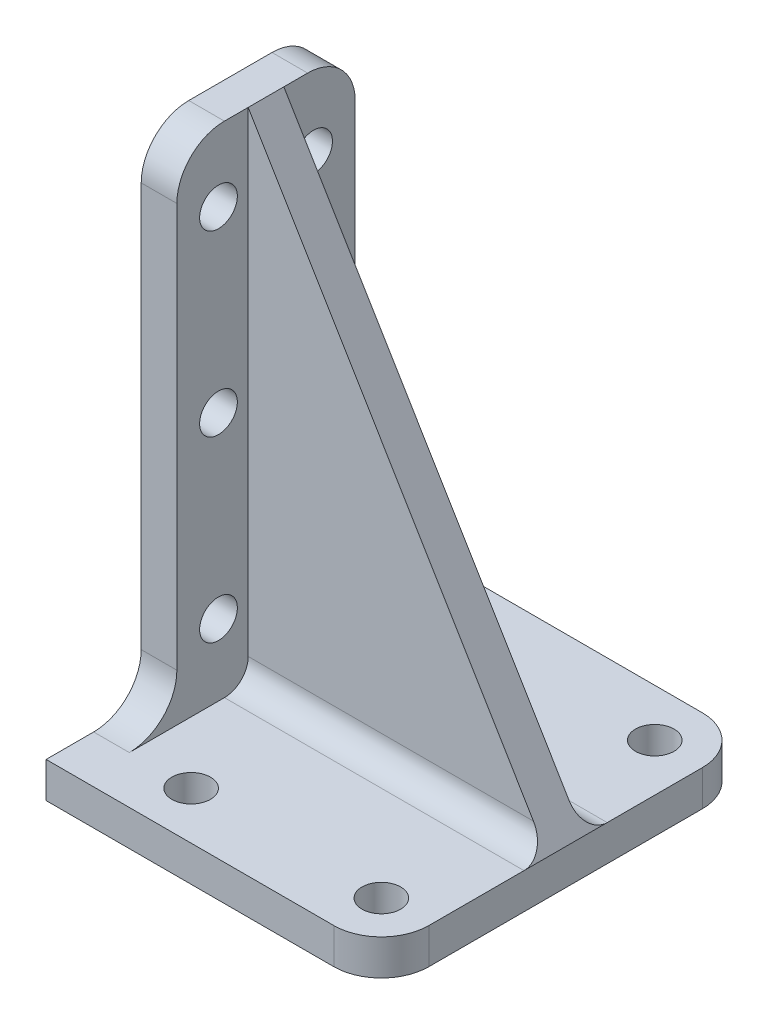
ISO-10303-21;
HEADER;
FILE_DESCRIPTION(('STEP AP214'),'2;1');
FILE_NAME('part.step','',(''),(''),'','','');
FILE_SCHEMA(('AUTOMOTIVE_DESIGN { 1 0 10303 214 1 1 1 1 }'));
ENDSEC;
DATA;
#1=APPLICATION_CONTEXT('core data for automotive mechanical design processes');
#2=APPLICATION_PROTOCOL_DEFINITION('international standard','automotive_design',2000,#1);
#3=PRODUCT_CONTEXT('',#1,'mechanical');
#4=PRODUCT('Part','Part','',(#3));
#5=PRODUCT_RELATED_PRODUCT_CATEGORY('part','',(#4));
#6=PRODUCT_DEFINITION_FORMATION('','',#4);
#7=PRODUCT_DEFINITION_CONTEXT('part definition',#1,'design');
#8=PRODUCT_DEFINITION('design','',#6,#7);
#9=PRODUCT_DEFINITION_SHAPE('','',#8);
#10=(LENGTH_UNIT() NAMED_UNIT(*) SI_UNIT(.MILLI.,.METRE.));
#11=(NAMED_UNIT(*) PLANE_ANGLE_UNIT() SI_UNIT($,.RADIAN.));
#12=(NAMED_UNIT(*) SI_UNIT($,.STERADIAN.) SOLID_ANGLE_UNIT());
#13=UNCERTAINTY_MEASURE_WITH_UNIT(LENGTH_MEASURE(1.E-05),#10,'distance_accuracy_value','');
#14=(GEOMETRIC_REPRESENTATION_CONTEXT(3) GLOBAL_UNCERTAINTY_ASSIGNED_CONTEXT((#13)) GLOBAL_UNIT_ASSIGNED_CONTEXT((#10,
#11,#12)) REPRESENTATION_CONTEXT('',''));
#15=CARTESIAN_POINT('',(0.,0.,0.));
#16=DIRECTION('',(0.,0.,1.));
#17=DIRECTION('',(1.,0.,0.));
#18=AXIS2_PLACEMENT_3D('',#15,#16,#17);
#19=CARTESIAN_POINT('',(0.,0.,30.));
#20=DIRECTION('',(0.,0.,-1.));
#21=DIRECTION('',(-1.,0.,0.));
#22=AXIS2_PLACEMENT_3D('',#19,#20,#21);
#23=PLANE('',#22);
#24=DIRECTION('',(0.,1.,0.));
#25=VECTOR('',#24,1.);
#26=CARTESIAN_POINT('',(6.,100.,30.));
#27=LINE('',#26,#25);
#28=CARTESIAN_POINT('',(6.,14.,30.));
#29=VERTEX_POINT('',#28);
#30=CARTESIAN_POINT('',(6.,82.,30.));
#31=VERTEX_POINT('',#30);
#32=EDGE_CURVE('E243',#29,#31,#27,.T.);
#33=ORIENTED_EDGE('',*,*,#32,.T.);
#34=DIRECTION('',(1.,0.,0.));
#35=VECTOR('',#34,1.);
#36=CARTESIAN_POINT('',(0.,82.,30.));
#37=LINE('',#36,#35);
#38=CARTESIAN_POINT('',(0.,82.,30.));
#39=VERTEX_POINT('',#38);
#40=EDGE_CURVE('E345',#31,#39,#37,.F.);
#41=ORIENTED_EDGE('',*,*,#40,.T.);
#42=DIRECTION('',(0.,-1.,0.));
#43=VECTOR('',#42,1.);
#44=CARTESIAN_POINT('',(0.,0.,30.));
#45=LINE('',#44,#43);
#46=CARTESIAN_POINT('',(0.,14.,30.));
#47=VERTEX_POINT('',#46);
#48=EDGE_CURVE('E192',#39,#47,#45,.T.);
#49=ORIENTED_EDGE('',*,*,#48,.T.);
#50=DIRECTION('',(-1.,0.,0.));
#51=VECTOR('',#50,1.);
#52=CARTESIAN_POINT('',(6.,14.,30.));
#53=LINE('',#52,#51);
#54=EDGE_CURVE('E284',#47,#29,#53,.F.);
#55=ORIENTED_EDGE('',*,*,#54,.T.);
#56=EDGE_LOOP('',(#33,#41,#49,#55));
#57=FACE_BOUND('',#56,.T.);
#58=ADVANCED_FACE('F42',(#57),#23,.F.);
#59=CARTESIAN_POINT('',(0.,100.,30.));
#60=DIRECTION('',(-0.857492925712544,-0.514495755427526,0.));
#61=DIRECTION('',(0.514495755427526,-0.857492925712544,0.));
#62=AXIS2_PLACEMENT_3D('',#59,#60,#61);
#63=PLANE('',#62);
#64=DIRECTION('',(0.514495755427526,-0.857492925712544,0.));
#65=VECTOR('',#64,1.);
#66=CARTESIAN_POINT('',(0.,100.,18.));
#67=LINE('',#66,#65);
#68=CARTESIAN_POINT('',(6.,90.,18.));
#69=VERTEX_POINT('',#68);
#70=CARTESIAN_POINT('',(54.,9.99999999999998,18.));
#71=VERTEX_POINT('',#70);
#72=EDGE_CURVE('E276',#69,#71,#67,.T.);
#73=ORIENTED_EDGE('',*,*,#72,.T.);
#74=CARTESIAN_POINT('',(54.,10.,22.));
#75=DIRECTION('',(-0.857492925712544,-0.514495755427526,0.));
#76=DIRECTION('',(0.514495755427526,-0.857492925712544,0.));
#77=AXIS2_PLACEMENT_3D('',#74,#75,#76);
#78=ELLIPSE('',#77,4.66476151587624,4.);
#79=CARTESIAN_POINT('',(56.4,6.,22.));
#80=VERTEX_POINT('',#79);
#81=EDGE_CURVE('E52',#71,#80,#78,.T.);
#82=ORIENTED_EDGE('',*,*,#81,.T.);
#83=DIRECTION('',(0.,0.,1.));
#84=VECTOR('',#83,1.);
#85=CARTESIAN_POINT('',(56.4,6.,0.));
#86=LINE('',#85,#84);
#87=CARTESIAN_POINT('',(56.4,6.,8.));
#88=VERTEX_POINT('',#87);
#89=EDGE_CURVE('E58',#88,#80,#86,.T.);
#90=ORIENTED_EDGE('',*,*,#89,.F.);
#91=CARTESIAN_POINT('',(54.,9.99999999999999,8.));
#92=DIRECTION('',(-0.857492925712544,-0.514495755427526,0.));
#93=DIRECTION('',(0.514495755427526,-0.857492925712544,0.));
#94=AXIS2_PLACEMENT_3D('',#91,#92,#93);
#95=ELLIPSE('',#94,4.66476151587624,4.);
#96=CARTESIAN_POINT('',(54.,9.99999999999998,12.));
#97=VERTEX_POINT('',#96);
#98=EDGE_CURVE('E11',#88,#97,#95,.T.);
#99=ORIENTED_EDGE('',*,*,#98,.T.);
#100=DIRECTION('',(-0.514495755427526,0.857492925712544,0.));
#101=VECTOR('',#100,1.);
#102=CARTESIAN_POINT('',(0.,100.,12.));
#103=LINE('',#102,#101);
#104=CARTESIAN_POINT('',(6.,90.,12.));
#105=VERTEX_POINT('',#104);
#106=EDGE_CURVE('E273',#97,#105,#103,.T.);
#107=ORIENTED_EDGE('',*,*,#106,.T.);
#108=DIRECTION('',(0.,0.,-1.));
#109=VECTOR('',#108,1.);
#110=CARTESIAN_POINT('',(6.,90.,30.));
#111=LINE('',#110,#109);
#112=EDGE_CURVE('E224',#69,#105,#111,.T.);
#113=ORIENTED_EDGE('',*,*,#112,.F.);
#114=EDGE_LOOP('',(#73,#82,#90,#99,#107,#113));
#115=FACE_BOUND('',#114,.T.);
#116=ADVANCED_FACE('F386',(#115),#63,.F.);
#117=CARTESIAN_POINT('',(60.,0.,30.));
#118=DIRECTION('',(0.,1.,0.));
#119=DIRECTION('',(-1.,0.,0.));
#120=AXIS2_PLACEMENT_3D('',#117,#118,#119);
#121=PLANE('',#120);
#122=CARTESIAN_POINT('',(16.4,0.,-8.));
#123=DIRECTION('',(0.,1.,0.));
#124=DIRECTION('',(0.,0.,1.));
#125=AXIS2_PLACEMENT_3D('',#122,#123,#124);
#126=CIRCLE('',#125,3.25);
#127=CARTESIAN_POINT('',(16.4,0.,-4.75));
#128=VERTEX_POINT('',#127);
#129=EDGE_CURVE('E489',#128,#128,#126,.T.);
#130=ORIENTED_EDGE('',*,*,#129,.T.);
#131=EDGE_LOOP('',(#130));
#132=FACE_BOUND('',#131,.T.);
#133=CARTESIAN_POINT('',(16.4,0.,38.));
#134=DIRECTION('',(0.,1.,0.));
#135=DIRECTION('',(0.,0.,1.));
#136=AXIS2_PLACEMENT_3D('',#133,#134,#135);
#137=CIRCLE('',#136,3.25);
#138=CARTESIAN_POINT('',(16.4,0.,41.25));
#139=VERTEX_POINT('',#138);
#140=EDGE_CURVE('E493',#139,#139,#137,.T.);
#141=ORIENTED_EDGE('',*,*,#140,.T.);
#142=EDGE_LOOP('',(#141));
#143=FACE_BOUND('',#142,.T.);
#144=CARTESIAN_POINT('',(48.4,0.,38.));
#145=DIRECTION('',(0.,1.,0.));
#146=DIRECTION('',(0.,0.,1.));
#147=AXIS2_PLACEMENT_3D('',#144,#145,#146);
#148=CIRCLE('',#147,3.25);
#149=CARTESIAN_POINT('',(48.4,0.,41.25));
#150=VERTEX_POINT('',#149);
#151=EDGE_CURVE('E497',#150,#150,#148,.T.);
#152=ORIENTED_EDGE('',*,*,#151,.T.);
#153=EDGE_LOOP('',(#152));
#154=FACE_BOUND('',#153,.T.);
#155=CARTESIAN_POINT('',(48.4,0.,-8.));
#156=DIRECTION('',(0.,1.,0.));
#157=DIRECTION('',(0.,0.,1.));
#158=AXIS2_PLACEMENT_3D('',#155,#156,#157);
#159=CIRCLE('',#158,3.25);
#160=CARTESIAN_POINT('',(48.4,0.,-4.75));
#161=VERTEX_POINT('',#160);
#162=EDGE_CURVE('E500',#161,#161,#159,.T.);
#163=ORIENTED_EDGE('',*,*,#162,.T.);
#164=EDGE_LOOP('',(#163));
#165=FACE_BOUND('',#164,.T.);
#166=DIRECTION('',(-1.,0.,0.));
#167=VECTOR('',#166,1.);
#168=CARTESIAN_POINT('',(56.4,0.,-16.));
#169=LINE('',#168,#167);
#170=CARTESIAN_POINT('',(48.4,0.,-16.));
#171=VERTEX_POINT('',#170);
#172=CARTESIAN_POINT('',(0.,0.,-16.));
#173=VERTEX_POINT('',#172);
#174=EDGE_CURVE('E169',#171,#173,#169,.T.);
#175=ORIENTED_EDGE('',*,*,#174,.F.);
#176=CARTESIAN_POINT('',(48.4,0.,-8.));
#177=DIRECTION('',(0.,1.,0.));
#178=DIRECTION('',(-1.,0.,0.));
#179=AXIS2_PLACEMENT_3D('',#176,#177,#178);
#180=CIRCLE('',#179,8.);
#181=CARTESIAN_POINT('',(56.4,0.,-8.));
#182=VERTEX_POINT('',#181);
#183=EDGE_CURVE('E315',#171,#182,#180,.F.);
#184=ORIENTED_EDGE('',*,*,#183,.T.);
#185=DIRECTION('',(0.,0.,1.));
#186=VECTOR('',#185,1.);
#187=CARTESIAN_POINT('',(56.4,0.,0.));
#188=LINE('',#187,#186);
#189=CARTESIAN_POINT('',(56.4,0.,38.));
#190=VERTEX_POINT('',#189);
#191=EDGE_CURVE('E220',#182,#190,#188,.T.);
#192=ORIENTED_EDGE('',*,*,#191,.T.);
#193=CARTESIAN_POINT('',(48.4,0.,38.));
#194=DIRECTION('',(0.,1.,0.));
#195=DIRECTION('',(-1.,0.,0.));
#196=AXIS2_PLACEMENT_3D('',#193,#194,#195);
#197=CIRCLE('',#196,8.);
#198=CARTESIAN_POINT('',(48.4,0.,46.));
#199=VERTEX_POINT('',#198);
#200=EDGE_CURVE('E312',#190,#199,#197,.F.);
#201=ORIENTED_EDGE('',*,*,#200,.T.);
#202=DIRECTION('',(1.,0.,0.));
#203=VECTOR('',#202,1.);
#204=CARTESIAN_POINT('',(56.4,0.,46.));
#205=LINE('',#204,#203);
#206=CARTESIAN_POINT('',(0.,0.,46.));
#207=VERTEX_POINT('',#206);
#208=EDGE_CURVE('E186',#207,#199,#205,.T.);
#209=ORIENTED_EDGE('',*,*,#208,.F.);
#210=DIRECTION('',(0.,0.,-1.));
#211=VECTOR('',#210,1.);
#212=CARTESIAN_POINT('',(0.,0.,30.));
#213=LINE('',#212,#211);
#214=EDGE_CURVE('E183',#207,#173,#213,.T.);
#215=ORIENTED_EDGE('',*,*,#214,.T.);
#216=EDGE_LOOP('',(#175,#184,#192,#201,#209,#215));
#217=FACE_BOUND('',#216,.T.);
#218=ADVANCED_FACE('F184',(#132,#143,#154,#165,#217),#121,.F.);
#219=CARTESIAN_POINT('',(0.,0.,30.));
#220=DIRECTION('',(1.,0.,0.));
#221=DIRECTION('',(0.,0.,-1.));
#222=AXIS2_PLACEMENT_3D('',#219,#220,#221);
#223=PLANE('',#222);
#224=CARTESIAN_POINT('',(0.,78.,6.99999999999998));
#225=DIRECTION('',(1.,0.,0.));
#226=DIRECTION('',(0.,0.,1.));
#227=AXIS2_PLACEMENT_3D('',#224,#225,#226);
#228=CIRCLE('',#227,3.175);
#229=CARTESIAN_POINT('',(0.,78.,10.175));
#230=VERTEX_POINT('',#229);
#231=EDGE_CURVE('E503',#230,#230,#228,.T.);
#232=ORIENTED_EDGE('',*,*,#231,.T.);
#233=EDGE_LOOP('',(#232));
#234=FACE_BOUND('',#233,.T.);
#235=CARTESIAN_POINT('',(0.,48.,6.99999999999998));
#236=DIRECTION('',(1.,0.,0.));
#237=DIRECTION('',(0.,0.,1.));
#238=AXIS2_PLACEMENT_3D('',#235,#236,#237);
#239=CIRCLE('',#238,3.175);
#240=CARTESIAN_POINT('',(0.,48.,10.175));
#241=VERTEX_POINT('',#240);
#242=EDGE_CURVE('E546',#241,#241,#239,.T.);
#243=ORIENTED_EDGE('',*,*,#242,.T.);
#244=EDGE_LOOP('',(#243));
#245=FACE_BOUND('',#244,.T.);
#246=CARTESIAN_POINT('',(0.,18.0000000000001,6.99999999999998));
#247=DIRECTION('',(1.,0.,0.));
#248=DIRECTION('',(0.,0.,1.));
#249=AXIS2_PLACEMENT_3D('',#246,#247,#248);
#250=CIRCLE('',#249,3.175);
#251=CARTESIAN_POINT('',(0.,18.0000000000001,10.175));
#252=VERTEX_POINT('',#251);
#253=EDGE_CURVE('E538',#252,#252,#250,.T.);
#254=ORIENTED_EDGE('',*,*,#253,.T.);
#255=EDGE_LOOP('',(#254));
#256=FACE_BOUND('',#255,.T.);
#257=CARTESIAN_POINT('',(0.,18.,23.));
#258=DIRECTION('',(1.,0.,0.));
#259=DIRECTION('',(0.,0.,-1.));
#260=AXIS2_PLACEMENT_3D('',#257,#258,#259);
#261=CIRCLE('',#260,3.175);
#262=CARTESIAN_POINT('',(0.,18.,19.825));
#263=VERTEX_POINT('',#262);
#264=EDGE_CURVE('E530',#263,#263,#261,.T.);
#265=ORIENTED_EDGE('',*,*,#264,.T.);
#266=EDGE_LOOP('',(#265));
#267=FACE_BOUND('',#266,.T.);
#268=CARTESIAN_POINT('',(0.,48.,23.));
#269=DIRECTION('',(1.,0.,0.));
#270=DIRECTION('',(0.,0.,-1.));
#271=AXIS2_PLACEMENT_3D('',#268,#269,#270);
#272=CIRCLE('',#271,3.175);
#273=CARTESIAN_POINT('',(0.,48.,19.825));
#274=VERTEX_POINT('',#273);
#275=EDGE_CURVE('E522',#274,#274,#272,.T.);
#276=ORIENTED_EDGE('',*,*,#275,.T.);
#277=EDGE_LOOP('',(#276));
#278=FACE_BOUND('',#277,.T.);
#279=CARTESIAN_POINT('',(0.,78.,23.));
#280=DIRECTION('',(1.,0.,0.));
#281=DIRECTION('',(0.,0.,-1.));
#282=AXIS2_PLACEMENT_3D('',#279,#280,#281);
#283=CIRCLE('',#282,3.175);
#284=CARTESIAN_POINT('',(0.,78.,19.825));
#285=VERTEX_POINT('',#284);
#286=EDGE_CURVE('E180',#285,#285,#283,.T.);
#287=ORIENTED_EDGE('',*,*,#286,.T.);
#288=EDGE_LOOP('',(#287));
#289=FACE_BOUND('',#288,.T.);
#290=ORIENTED_EDGE('',*,*,#48,.F.);
#291=CARTESIAN_POINT('',(0.,82.,22.));
#292=DIRECTION('',(1.,0.,0.));
#293=DIRECTION('',(0.,0.,-1.));
#294=AXIS2_PLACEMENT_3D('',#291,#292,#293);
#295=CIRCLE('',#294,8.);
#296=CARTESIAN_POINT('',(0.,90.,22.));
#297=VERTEX_POINT('',#296);
#298=EDGE_CURVE('E351',#39,#297,#295,.F.);
#299=ORIENTED_EDGE('',*,*,#298,.T.);
#300=DIRECTION('',(0.,0.,-1.));
#301=VECTOR('',#300,1.);
#302=CARTESIAN_POINT('',(0.,90.,30.));
#303=LINE('',#302,#301);
#304=CARTESIAN_POINT('',(0.,90.,8.));
#305=VERTEX_POINT('',#304);
#306=EDGE_CURVE('E227',#297,#305,#303,.T.);
#307=ORIENTED_EDGE('',*,*,#306,.T.);
#308=CARTESIAN_POINT('',(0.,82.,8.));
#309=DIRECTION('',(1.,0.,0.));
#310=DIRECTION('',(0.,0.,-1.));
#311=AXIS2_PLACEMENT_3D('',#308,#309,#310);
#312=CIRCLE('',#311,8.);
#313=CARTESIAN_POINT('',(0.,82.,0.));
#314=VERTEX_POINT('',#313);
#315=EDGE_CURVE('E348',#305,#314,#312,.F.);
#316=ORIENTED_EDGE('',*,*,#315,.T.);
#317=DIRECTION('',(0.,-1.,0.));
#318=VECTOR('',#317,1.);
#319=CARTESIAN_POINT('',(0.,0.,0.));
#320=LINE('',#319,#318);
#321=CARTESIAN_POINT('',(0.,14.,0.));
#322=VERTEX_POINT('',#321);
#323=EDGE_CURVE('E266',#314,#322,#320,.T.);
#324=ORIENTED_EDGE('',*,*,#323,.T.);
#325=CARTESIAN_POINT('',(0.,14.,-8.));
#326=DIRECTION('',(1.,0.,0.));
#327=DIRECTION('',(0.,0.,-1.));
#328=AXIS2_PLACEMENT_3D('',#325,#326,#327);
#329=CIRCLE('',#328,8.);
#330=CARTESIAN_POINT('',(0.,6.,-8.));
#331=VERTEX_POINT('',#330);
#332=EDGE_CURVE('E307',#322,#331,#329,.T.);
#333=ORIENTED_EDGE('',*,*,#332,.T.);
#334=DIRECTION('',(0.,0.,1.));
#335=VECTOR('',#334,1.);
#336=CARTESIAN_POINT('',(0.,6.,-16.));
#337=LINE('',#336,#335);
#338=CARTESIAN_POINT('',(0.,6.,-16.));
#339=VERTEX_POINT('',#338);
#340=EDGE_CURVE('E197',#339,#331,#337,.T.);
#341=ORIENTED_EDGE('',*,*,#340,.F.);
#342=DIRECTION('',(0.,1.,0.));
#343=VECTOR('',#342,1.);
#344=CARTESIAN_POINT('',(0.,6.,-16.));
#345=LINE('',#344,#343);
#346=EDGE_CURVE('E174',#173,#339,#345,.T.);
#347=ORIENTED_EDGE('',*,*,#346,.F.);
#348=ORIENTED_EDGE('',*,*,#214,.F.);
#349=DIRECTION('',(0.,-1.,0.));
#350=VECTOR('',#349,1.);
#351=CARTESIAN_POINT('',(0.,6.,46.));
#352=LINE('',#351,#350);
#353=CARTESIAN_POINT('',(0.,6.,46.));
#354=VERTEX_POINT('',#353);
#355=EDGE_CURVE('E211',#354,#207,#352,.T.);
#356=ORIENTED_EDGE('',*,*,#355,.F.);
#357=DIRECTION('',(0.,0.,-1.));
#358=VECTOR('',#357,1.);
#359=CARTESIAN_POINT('',(0.,6.,46.));
#360=LINE('',#359,#358);
#361=CARTESIAN_POINT('',(0.,6.,38.));
#362=VERTEX_POINT('',#361);
#363=EDGE_CURVE('E216',#354,#362,#360,.T.);
#364=ORIENTED_EDGE('',*,*,#363,.T.);
#365=CARTESIAN_POINT('',(0.,14.,38.));
#366=DIRECTION('',(1.,0.,0.));
#367=DIRECTION('',(0.,0.,-1.));
#368=AXIS2_PLACEMENT_3D('',#365,#366,#367);
#369=CIRCLE('',#368,8.);
#370=EDGE_CURVE('E295',#362,#47,#369,.T.);
#371=ORIENTED_EDGE('',*,*,#370,.T.);
#372=EDGE_LOOP('',(#290,#299,#307,#316,#324,#333,#341,#347,#348,#356,#364,#371));
#373=FACE_BOUND('',#372,.T.);
#374=ADVANCED_FACE('F195',(#234,#245,#256,#267,#278,#289,#373),#223,.F.);
#375=CARTESIAN_POINT('',(0.,0.,0.));
#376=DIRECTION('',(0.,0.,-1.));
#377=DIRECTION('',(-1.,0.,0.));
#378=AXIS2_PLACEMENT_3D('',#375,#376,#377);
#379=PLANE('',#378);
#380=ORIENTED_EDGE('',*,*,#323,.F.);
#381=DIRECTION('',(1.,0.,0.));
#382=VECTOR('',#381,1.);
#383=CARTESIAN_POINT('',(6.,82.,0.));
#384=LINE('',#383,#382);
#385=CARTESIAN_POINT('',(6.,82.,0.));
#386=VERTEX_POINT('',#385);
#387=EDGE_CURVE('E354',#314,#386,#384,.T.);
#388=ORIENTED_EDGE('',*,*,#387,.T.);
#389=DIRECTION('',(0.,-1.,0.));
#390=VECTOR('',#389,1.);
#391=CARTESIAN_POINT('',(6.,0.,0.));
#392=LINE('',#391,#390);
#393=CARTESIAN_POINT('',(6.,14.,0.));
#394=VERTEX_POINT('',#393);
#395=EDGE_CURVE('E191',#386,#394,#392,.T.);
#396=ORIENTED_EDGE('',*,*,#395,.T.);
#397=DIRECTION('',(1.,0.,0.));
#398=VECTOR('',#397,1.);
#399=CARTESIAN_POINT('',(0.,14.,0.));
#400=LINE('',#399,#398);
#401=EDGE_CURVE('E291',#394,#322,#400,.F.);
#402=ORIENTED_EDGE('',*,*,#401,.T.);
#403=EDGE_LOOP('',(#380,#388,#396,#402));
#404=FACE_BOUND('',#403,.T.);
#405=ADVANCED_FACE('F453',(#404),#379,.T.);
#406=CARTESIAN_POINT('',(60.,100.,12.));
#407=DIRECTION('',(0.,0.,1.));
#408=DIRECTION('',(0.,-1.,0.));
#409=AXIS2_PLACEMENT_3D('',#406,#407,#408);
#410=PLANE('',#409);
#411=ORIENTED_EDGE('',*,*,#106,.F.);
#412=DIRECTION('',(-1.,0.,0.));
#413=VECTOR('',#412,1.);
#414=CARTESIAN_POINT('',(6.,9.99999999999999,12.));
#415=LINE('',#414,#413);
#416=CARTESIAN_POINT('',(6.,9.99999999999999,12.));
#417=VERTEX_POINT('',#416);
#418=EDGE_CURVE('E371',#97,#417,#415,.T.);
#419=ORIENTED_EDGE('',*,*,#418,.T.);
#420=DIRECTION('',(0.,1.,0.));
#421=VECTOR('',#420,1.);
#422=CARTESIAN_POINT('',(6.,100.,12.));
#423=LINE('',#422,#421);
#424=EDGE_CURVE('E240',#417,#105,#423,.T.);
#425=ORIENTED_EDGE('',*,*,#424,.T.);
#426=EDGE_LOOP('',(#411,#419,#425));
#427=FACE_BOUND('',#426,.T.);
#428=ADVANCED_FACE('F428',(#427),#410,.F.);
#429=CARTESIAN_POINT('',(60.,6.,12.));
#430=DIRECTION('',(0.,-1.,0.));
#431=DIRECTION('',(0.,0.,-1.));
#432=AXIS2_PLACEMENT_3D('',#429,#430,#431);
#433=PLANE('',#432);
#434=CARTESIAN_POINT('',(16.4,6.,-8.));
#435=DIRECTION('',(0.,1.,0.));
#436=DIRECTION('',(0.,0.,1.));
#437=AXIS2_PLACEMENT_3D('',#434,#435,#436);
#438=CIRCLE('',#437,3.25);
#439=CARTESIAN_POINT('',(16.4,6.,-4.75));
#440=VERTEX_POINT('',#439);
#441=EDGE_CURVE('E587',#440,#440,#438,.T.);
#442=ORIENTED_EDGE('',*,*,#441,.F.);
#443=EDGE_LOOP('',(#442));
#444=FACE_BOUND('',#443,.T.);
#445=CARTESIAN_POINT('',(48.4,6.,-8.));
#446=DIRECTION('',(0.,1.,0.));
#447=DIRECTION('',(0.,0.,1.));
#448=AXIS2_PLACEMENT_3D('',#445,#446,#447);
#449=CIRCLE('',#448,3.25);
#450=CARTESIAN_POINT('',(48.4,6.,-4.75));
#451=VERTEX_POINT('',#450);
#452=EDGE_CURVE('E504',#451,#451,#449,.T.);
#453=ORIENTED_EDGE('',*,*,#452,.F.);
#454=EDGE_LOOP('',(#453));
#455=FACE_BOUND('',#454,.T.);
#456=DIRECTION('',(0.,0.,1.));
#457=VECTOR('',#456,1.);
#458=CARTESIAN_POINT('',(6.,6.,12.));
#459=LINE('',#458,#457);
#460=CARTESIAN_POINT('',(6.,6.,-8.));
#461=VERTEX_POINT('',#460);
#462=CARTESIAN_POINT('',(6.,6.,8.));
#463=VERTEX_POINT('',#462);
#464=EDGE_CURVE('E231',#461,#463,#459,.T.);
#465=ORIENTED_EDGE('',*,*,#464,.T.);
#466=DIRECTION('',(-1.,0.,0.));
#467=VECTOR('',#466,1.);
#468=CARTESIAN_POINT('',(56.4,6.,8.));
#469=LINE('',#468,#467);
#470=EDGE_CURVE('E378',#463,#88,#469,.F.);
#471=ORIENTED_EDGE('',*,*,#470,.T.);
#472=DIRECTION('',(0.,0.,1.));
#473=VECTOR('',#472,1.);
#474=CARTESIAN_POINT('',(56.4,5.99999999999999,30.));
#475=LINE('',#474,#473);
#476=CARTESIAN_POINT('',(56.4,5.99999999999999,-8.));
#477=VERTEX_POINT('',#476);
#478=EDGE_CURVE('E257',#477,#88,#475,.T.);
#479=ORIENTED_EDGE('',*,*,#478,.F.);
#480=CARTESIAN_POINT('',(48.4,6.,-8.));
#481=DIRECTION('',(0.,-1.,0.));
#482=DIRECTION('',(0.,0.,-1.));
#483=AXIS2_PLACEMENT_3D('',#480,#481,#482);
#484=CIRCLE('',#483,8.);
#485=CARTESIAN_POINT('',(48.4,6.,-16.));
#486=VERTEX_POINT('',#485);
#487=EDGE_CURVE('E324',#477,#486,#484,.F.);
#488=ORIENTED_EDGE('',*,*,#487,.T.);
#489=DIRECTION('',(1.,0.,0.));
#490=VECTOR('',#489,1.);
#491=CARTESIAN_POINT('',(56.4,6.,-16.));
#492=LINE('',#491,#490);
#493=EDGE_CURVE('E200',#339,#486,#492,.T.);
#494=ORIENTED_EDGE('',*,*,#493,.F.);
#495=ORIENTED_EDGE('',*,*,#340,.T.);
#496=DIRECTION('',(1.,0.,0.));
#497=VECTOR('',#496,1.);
#498=CARTESIAN_POINT('',(60.,6.,-8.));
#499=LINE('',#498,#497);
#500=EDGE_CURVE('E287',#331,#461,#499,.T.);
#501=ORIENTED_EDGE('',*,*,#500,.T.);
#502=EDGE_LOOP('',(#465,#471,#479,#488,#494,#495,#501));
#503=FACE_BOUND('',#502,.T.);
#504=ADVANCED_FACE('F422',(#444,#455,#503),#433,.F.);
#505=CARTESIAN_POINT('',(6.,0.,0.));
#506=DIRECTION('',(1.,0.,0.));
#507=DIRECTION('',(0.,0.,-1.));
#508=AXIS2_PLACEMENT_3D('',#505,#506,#507);
#509=PLANE('',#508);
#510=CARTESIAN_POINT('',(6.,78.,6.99999999999998));
#511=DIRECTION('',(1.,0.,0.));
#512=DIRECTION('',(0.,0.,1.));
#513=AXIS2_PLACEMENT_3D('',#510,#511,#512);
#514=CIRCLE('',#513,3.175);
#515=CARTESIAN_POINT('',(6.,78.,10.175));
#516=VERTEX_POINT('',#515);
#517=EDGE_CURVE('E509',#516,#516,#514,.T.);
#518=ORIENTED_EDGE('',*,*,#517,.F.);
#519=EDGE_LOOP('',(#518));
#520=FACE_BOUND('',#519,.T.);
#521=CARTESIAN_POINT('',(6.,48.,6.99999999999998));
#522=DIRECTION('',(1.,0.,0.));
#523=DIRECTION('',(0.,0.,1.));
#524=AXIS2_PLACEMENT_3D('',#521,#522,#523);
#525=CIRCLE('',#524,3.175);
#526=CARTESIAN_POINT('',(6.,48.,10.175));
#527=VERTEX_POINT('',#526);
#528=EDGE_CURVE('E542',#527,#527,#525,.T.);
#529=ORIENTED_EDGE('',*,*,#528,.F.);
#530=EDGE_LOOP('',(#529));
#531=FACE_BOUND('',#530,.T.);
#532=CARTESIAN_POINT('',(6.,18.0000000000001,6.99999999999998));
#533=DIRECTION('',(1.,0.,0.));
#534=DIRECTION('',(0.,0.,1.));
#535=AXIS2_PLACEMENT_3D('',#532,#533,#534);
#536=CIRCLE('',#535,3.175);
#537=CARTESIAN_POINT('',(6.,18.0000000000001,10.175));
#538=VERTEX_POINT('',#537);
#539=EDGE_CURVE('E534',#538,#538,#536,.T.);
#540=ORIENTED_EDGE('',*,*,#539,.F.);
#541=EDGE_LOOP('',(#540));
#542=FACE_BOUND('',#541,.T.);
#543=ORIENTED_EDGE('',*,*,#424,.F.);
#544=CARTESIAN_POINT('',(6.,9.99999999999999,8.));
#545=DIRECTION('',(1.,0.,0.));
#546=DIRECTION('',(0.,0.,-1.));
#547=AXIS2_PLACEMENT_3D('',#544,#545,#546);
#548=CIRCLE('',#547,4.);
#549=EDGE_CURVE('E375',#417,#463,#548,.T.);
#550=ORIENTED_EDGE('',*,*,#549,.T.);
#551=ORIENTED_EDGE('',*,*,#464,.F.);
#552=CARTESIAN_POINT('',(6.,14.,-8.));
#553=DIRECTION('',(1.,0.,0.));
#554=DIRECTION('',(0.,0.,-1.));
#555=AXIS2_PLACEMENT_3D('',#552,#553,#554);
#556=CIRCLE('',#555,8.);
#557=EDGE_CURVE('E303',#461,#394,#556,.F.);
#558=ORIENTED_EDGE('',*,*,#557,.T.);
#559=ORIENTED_EDGE('',*,*,#395,.F.);
#560=CARTESIAN_POINT('',(6.,82.,8.));
#561=DIRECTION('',(1.,0.,0.));
#562=DIRECTION('',(0.,0.,-1.));
#563=AXIS2_PLACEMENT_3D('',#560,#561,#562);
#564=CIRCLE('',#563,8.);
#565=CARTESIAN_POINT('',(6.,90.,8.));
#566=VERTEX_POINT('',#565);
#567=EDGE_CURVE('E358',#386,#566,#564,.T.);
#568=ORIENTED_EDGE('',*,*,#567,.T.);
#569=DIRECTION('',(0.,0.,1.));
#570=VECTOR('',#569,1.);
#571=CARTESIAN_POINT('',(6.,90.,30.));
#572=LINE('',#571,#570);
#573=EDGE_CURVE('E247',#566,#105,#572,.T.);
#574=ORIENTED_EDGE('',*,*,#573,.T.);
#575=EDGE_LOOP('',(#543,#550,#551,#558,#559,#568,#574));
#576=FACE_BOUND('',#575,.T.);
#577=ADVANCED_FACE('F432',(#520,#531,#542,#576),#509,.T.);
#578=CARTESIAN_POINT('',(60.,100.,18.));
#579=DIRECTION('',(0.,0.,-1.));
#580=DIRECTION('',(0.,1.,0.));
#581=AXIS2_PLACEMENT_3D('',#578,#579,#580);
#582=PLANE('',#581);
#583=DIRECTION('',(0.,-1.,0.));
#584=VECTOR('',#583,1.);
#585=CARTESIAN_POINT('',(6.,100.,18.));
#586=LINE('',#585,#584);
#587=CARTESIAN_POINT('',(6.,9.99999999999999,18.));
#588=VERTEX_POINT('',#587);
#589=EDGE_CURVE('E235',#69,#588,#586,.T.);
#590=ORIENTED_EDGE('',*,*,#589,.T.);
#591=DIRECTION('',(-1.,0.,0.));
#592=VECTOR('',#591,1.);
#593=CARTESIAN_POINT('',(56.4,10.,18.));
#594=LINE('',#593,#592);
#595=EDGE_CURVE('E368',#588,#71,#594,.F.);
#596=ORIENTED_EDGE('',*,*,#595,.T.);
#597=ORIENTED_EDGE('',*,*,#72,.F.);
#598=EDGE_LOOP('',(#590,#596,#597));
#599=FACE_BOUND('',#598,.T.);
#600=ADVANCED_FACE('F440',(#599),#582,.F.);
#601=CARTESIAN_POINT('',(60.,6.,18.));
#602=DIRECTION('',(0.,-1.,0.));
#603=DIRECTION('',(0.,0.,-1.));
#604=AXIS2_PLACEMENT_3D('',#601,#602,#603);
#605=PLANE('',#604);
#606=CARTESIAN_POINT('',(16.4,6.,38.));
#607=DIRECTION('',(0.,1.,0.));
#608=DIRECTION('',(0.,0.,1.));
#609=AXIS2_PLACEMENT_3D('',#606,#607,#608);
#610=CIRCLE('',#609,3.25);
#611=CARTESIAN_POINT('',(16.4,6.,41.25));
#612=VERTEX_POINT('',#611);
#613=EDGE_CURVE('E926',#612,#612,#610,.T.);
#614=ORIENTED_EDGE('',*,*,#613,.F.);
#615=EDGE_LOOP('',(#614));
#616=FACE_BOUND('',#615,.T.);
#617=CARTESIAN_POINT('',(48.4,6.,38.));
#618=DIRECTION('',(0.,1.,0.));
#619=DIRECTION('',(0.,0.,1.));
#620=AXIS2_PLACEMENT_3D('',#617,#618,#619);
#621=CIRCLE('',#620,3.25);
#622=CARTESIAN_POINT('',(48.4,6.,41.25));
#623=VERTEX_POINT('',#622);
#624=EDGE_CURVE('E512',#623,#623,#621,.T.);
#625=ORIENTED_EDGE('',*,*,#624,.F.);
#626=EDGE_LOOP('',(#625));
#627=FACE_BOUND('',#626,.T.);
#628=DIRECTION('',(0.,0.,1.));
#629=VECTOR('',#628,1.);
#630=CARTESIAN_POINT('',(56.4,6.00000000000001,30.));
#631=LINE('',#630,#629);
#632=CARTESIAN_POINT('',(56.4,6.00000000000001,38.));
#633=VERTEX_POINT('',#632);
#634=EDGE_CURVE('E263',#80,#633,#631,.T.);
#635=ORIENTED_EDGE('',*,*,#634,.F.);
#636=DIRECTION('',(-1.,0.,0.));
#637=VECTOR('',#636,1.);
#638=CARTESIAN_POINT('',(6.,6.,22.));
#639=LINE('',#638,#637);
#640=CARTESIAN_POINT('',(6.,6.,22.));
#641=VERTEX_POINT('',#640);
#642=EDGE_CURVE('E361',#80,#641,#639,.T.);
#643=ORIENTED_EDGE('',*,*,#642,.T.);
#644=DIRECTION('',(0.,0.,1.));
#645=VECTOR('',#644,1.);
#646=CARTESIAN_POINT('',(6.,6.,18.));
#647=LINE('',#646,#645);
#648=CARTESIAN_POINT('',(6.,6.,38.));
#649=VERTEX_POINT('',#648);
#650=EDGE_CURVE('E239',#641,#649,#647,.T.);
#651=ORIENTED_EDGE('',*,*,#650,.T.);
#652=DIRECTION('',(-1.,0.,0.));
#653=VECTOR('',#652,1.);
#654=CARTESIAN_POINT('',(0.,6.,38.));
#655=LINE('',#654,#653);
#656=EDGE_CURVE('E280',#649,#362,#655,.T.);
#657=ORIENTED_EDGE('',*,*,#656,.T.);
#658=ORIENTED_EDGE('',*,*,#363,.F.);
#659=DIRECTION('',(-1.,0.,0.));
#660=VECTOR('',#659,1.);
#661=CARTESIAN_POINT('',(56.4,6.,46.));
#662=LINE('',#661,#660);
#663=CARTESIAN_POINT('',(48.4,6.,46.));
#664=VERTEX_POINT('',#663);
#665=EDGE_CURVE('E208',#664,#354,#662,.T.);
#666=ORIENTED_EDGE('',*,*,#665,.F.);
#667=CARTESIAN_POINT('',(48.4,6.,38.));
#668=DIRECTION('',(0.,-1.,0.));
#669=DIRECTION('',(0.,0.,-1.));
#670=AXIS2_PLACEMENT_3D('',#667,#668,#669);
#671=CIRCLE('',#670,8.);
#672=EDGE_CURVE('E331',#664,#633,#671,.F.);
#673=ORIENTED_EDGE('',*,*,#672,.T.);
#674=EDGE_LOOP('',(#635,#643,#651,#657,#658,#666,#673));
#675=FACE_BOUND('',#674,.T.);
#676=ADVANCED_FACE('F394',(#616,#627,#675),#605,.F.);
#677=CARTESIAN_POINT('',(6.,0.,0.));
#678=DIRECTION('',(-1.,0.,0.));
#679=DIRECTION('',(0.,0.,1.));
#680=AXIS2_PLACEMENT_3D('',#677,#678,#679);
#681=PLANE('',#680);
#682=CARTESIAN_POINT('',(6.,18.,23.));
#683=DIRECTION('',(1.,0.,0.));
#684=DIRECTION('',(0.,0.,-1.));
#685=AXIS2_PLACEMENT_3D('',#682,#683,#684);
#686=CIRCLE('',#685,3.175);
#687=CARTESIAN_POINT('',(6.,18.,19.825));
#688=VERTEX_POINT('',#687);
#689=EDGE_CURVE('E526',#688,#688,#686,.T.);
#690=ORIENTED_EDGE('',*,*,#689,.F.);
#691=EDGE_LOOP('',(#690));
#692=FACE_BOUND('',#691,.T.);
#693=CARTESIAN_POINT('',(6.,48.,23.));
#694=DIRECTION('',(1.,0.,0.));
#695=DIRECTION('',(0.,0.,-1.));
#696=AXIS2_PLACEMENT_3D('',#693,#694,#695);
#697=CIRCLE('',#696,3.175);
#698=CARTESIAN_POINT('',(6.,48.,19.825));
#699=VERTEX_POINT('',#698);
#700=EDGE_CURVE('E517',#699,#699,#697,.T.);
#701=ORIENTED_EDGE('',*,*,#700,.F.);
#702=EDGE_LOOP('',(#701));
#703=FACE_BOUND('',#702,.T.);
#704=CARTESIAN_POINT('',(6.,78.,23.));
#705=DIRECTION('',(1.,0.,0.));
#706=DIRECTION('',(0.,0.,-1.));
#707=AXIS2_PLACEMENT_3D('',#704,#705,#706);
#708=CIRCLE('',#707,3.175);
#709=CARTESIAN_POINT('',(6.,78.,19.825));
#710=VERTEX_POINT('',#709);
#711=EDGE_CURVE('E521',#710,#710,#708,.T.);
#712=ORIENTED_EDGE('',*,*,#711,.F.);
#713=EDGE_LOOP('',(#712));
#714=FACE_BOUND('',#713,.T.);
#715=ORIENTED_EDGE('',*,*,#650,.F.);
#716=CARTESIAN_POINT('',(6.,10.,22.));
#717=DIRECTION('',(-1.,0.,0.));
#718=DIRECTION('',(0.,0.,1.));
#719=AXIS2_PLACEMENT_3D('',#716,#717,#718);
#720=CIRCLE('',#719,4.);
#721=EDGE_CURVE('E365',#641,#588,#720,.F.);
#722=ORIENTED_EDGE('',*,*,#721,.T.);
#723=ORIENTED_EDGE('',*,*,#589,.F.);
#724=DIRECTION('',(0.,0.,-1.));
#725=VECTOR('',#724,1.);
#726=CARTESIAN_POINT('',(6.,90.,30.));
#727=LINE('',#726,#725);
#728=CARTESIAN_POINT('',(6.,90.,22.));
#729=VERTEX_POINT('',#728);
#730=EDGE_CURVE('E260',#729,#69,#727,.T.);
#731=ORIENTED_EDGE('',*,*,#730,.F.);
#732=CARTESIAN_POINT('',(6.,82.,22.));
#733=DIRECTION('',(-1.,0.,0.));
#734=DIRECTION('',(0.,0.,1.));
#735=AXIS2_PLACEMENT_3D('',#732,#733,#734);
#736=CIRCLE('',#735,8.);
#737=EDGE_CURVE('E342',#729,#31,#736,.F.);
#738=ORIENTED_EDGE('',*,*,#737,.T.);
#739=ORIENTED_EDGE('',*,*,#32,.F.);
#740=CARTESIAN_POINT('',(6.,14.,38.));
#741=DIRECTION('',(-1.,0.,0.));
#742=DIRECTION('',(0.,0.,1.));
#743=AXIS2_PLACEMENT_3D('',#740,#741,#742);
#744=CIRCLE('',#743,8.);
#745=EDGE_CURVE('E299',#29,#649,#744,.T.);
#746=ORIENTED_EDGE('',*,*,#745,.T.);
#747=EDGE_LOOP('',(#715,#722,#723,#731,#738,#739,#746));
#748=FACE_BOUND('',#747,.T.);
#749=ADVANCED_FACE('F396',(#692,#703,#714,#748),#681,.F.);
#750=CARTESIAN_POINT('',(0.,90.,30.));
#751=DIRECTION('',(0.,-1.,0.));
#752=DIRECTION('',(0.,0.,-1.));
#753=AXIS2_PLACEMENT_3D('',#750,#751,#752);
#754=PLANE('',#753);
#755=ORIENTED_EDGE('',*,*,#306,.F.);
#756=DIRECTION('',(1.,0.,0.));
#757=VECTOR('',#756,1.);
#758=CARTESIAN_POINT('',(0.,90.,22.));
#759=LINE('',#758,#757);
#760=EDGE_CURVE('E338',#297,#729,#759,.T.);
#761=ORIENTED_EDGE('',*,*,#760,.T.);
#762=ORIENTED_EDGE('',*,*,#730,.T.);
#763=ORIENTED_EDGE('',*,*,#112,.T.);
#764=ORIENTED_EDGE('',*,*,#573,.F.);
#765=DIRECTION('',(1.,0.,0.));
#766=VECTOR('',#765,1.);
#767=CARTESIAN_POINT('',(0.,90.,8.));
#768=LINE('',#767,#766);
#769=EDGE_CURVE('E335',#566,#305,#768,.F.);
#770=ORIENTED_EDGE('',*,*,#769,.T.);
#771=EDGE_LOOP('',(#755,#761,#762,#763,#764,#770));
#772=FACE_BOUND('',#771,.T.);
#773=ADVANCED_FACE('F437',(#772),#754,.F.);
#774=CARTESIAN_POINT('',(56.4,0.,0.));
#775=DIRECTION('',(-1.,0.,0.));
#776=DIRECTION('',(0.,0.,1.));
#777=AXIS2_PLACEMENT_3D('',#774,#775,#776);
#778=PLANE('',#777);
#779=ORIENTED_EDGE('',*,*,#191,.F.);
#780=DIRECTION('',(0.,-1.,0.));
#781=VECTOR('',#780,1.);
#782=CARTESIAN_POINT('',(56.4,6.,-8.));
#783=LINE('',#782,#781);
#784=EDGE_CURVE('E321',#182,#477,#783,.F.);
#785=ORIENTED_EDGE('',*,*,#784,.T.);
#786=ORIENTED_EDGE('',*,*,#478,.T.);
#787=ORIENTED_EDGE('',*,*,#89,.T.);
#788=ORIENTED_EDGE('',*,*,#634,.T.);
#789=DIRECTION('',(0.,1.,0.));
#790=VECTOR('',#789,1.);
#791=CARTESIAN_POINT('',(56.4,0.,38.));
#792=LINE('',#791,#790);
#793=EDGE_CURVE('E318',#633,#190,#792,.F.);
#794=ORIENTED_EDGE('',*,*,#793,.T.);
#795=EDGE_LOOP('',(#779,#785,#786,#787,#788,#794));
#796=FACE_BOUND('',#795,.T.);
#797=ADVANCED_FACE('F414',(#796),#778,.F.);
#798=CARTESIAN_POINT('',(0.,0.,46.));
#799=DIRECTION('',(0.,0.,-1.));
#800=DIRECTION('',(-1.,0.,0.));
#801=AXIS2_PLACEMENT_3D('',#798,#799,#800);
#802=PLANE('',#801);
#803=ORIENTED_EDGE('',*,*,#208,.T.);
#804=DIRECTION('',(0.,1.,0.));
#805=VECTOR('',#804,1.);
#806=CARTESIAN_POINT('',(48.4,0.,46.));
#807=LINE('',#806,#805);
#808=EDGE_CURVE('E327',#199,#664,#807,.T.);
#809=ORIENTED_EDGE('',*,*,#808,.T.);
#810=ORIENTED_EDGE('',*,*,#665,.T.);
#811=ORIENTED_EDGE('',*,*,#355,.T.);
#812=EDGE_LOOP('',(#803,#809,#810,#811));
#813=FACE_BOUND('',#812,.T.);
#814=ADVANCED_FACE('F407',(#813),#802,.F.);
#815=CARTESIAN_POINT('',(0.,0.,-16.));
#816=DIRECTION('',(0.,0.,-1.));
#817=DIRECTION('',(-1.,0.,0.));
#818=AXIS2_PLACEMENT_3D('',#815,#816,#817);
#819=PLANE('',#818);
#820=ORIENTED_EDGE('',*,*,#493,.T.);
#821=DIRECTION('',(0.,-1.,0.));
#822=VECTOR('',#821,1.);
#823=CARTESIAN_POINT('',(48.4,0.,-16.));
#824=LINE('',#823,#822);
#825=EDGE_CURVE('E177',#486,#171,#824,.T.);
#826=ORIENTED_EDGE('',*,*,#825,.T.);
#827=ORIENTED_EDGE('',*,*,#174,.T.);
#828=ORIENTED_EDGE('',*,*,#346,.T.);
#829=EDGE_LOOP('',(#820,#826,#827,#828));
#830=FACE_BOUND('',#829,.T.);
#831=ADVANCED_FACE('F172',(#830),#819,.T.);
#832=CARTESIAN_POINT('',(60.,14.,38.));
#833=DIRECTION('',(1.,0.,0.));
#834=DIRECTION('',(0.,0.,-1.));
#835=AXIS2_PLACEMENT_3D('',#832,#833,#834);
#836=CYLINDRICAL_SURFACE('',#835,8.);
#837=ORIENTED_EDGE('',*,*,#745,.F.);
#838=ORIENTED_EDGE('',*,*,#54,.F.);
#839=ORIENTED_EDGE('',*,*,#370,.F.);
#840=ORIENTED_EDGE('',*,*,#656,.F.);
#841=EDGE_LOOP('',(#837,#838,#839,#840));
#842=FACE_BOUND('',#841,.T.);
#843=ADVANCED_FACE('F403',(#842),#836,.F.);
#844=CARTESIAN_POINT('',(60.,14.,-8.));
#845=DIRECTION('',(1.,0.,0.));
#846=DIRECTION('',(0.,0.,-1.));
#847=AXIS2_PLACEMENT_3D('',#844,#845,#846);
#848=CYLINDRICAL_SURFACE('',#847,8.);
#849=ORIENTED_EDGE('',*,*,#332,.F.);
#850=ORIENTED_EDGE('',*,*,#401,.F.);
#851=ORIENTED_EDGE('',*,*,#557,.F.);
#852=ORIENTED_EDGE('',*,*,#500,.F.);
#853=EDGE_LOOP('',(#849,#850,#851,#852));
#854=FACE_BOUND('',#853,.T.);
#855=ADVANCED_FACE('F459',(#854),#848,.F.);
#856=CARTESIAN_POINT('',(48.4,0.,-8.));
#857=DIRECTION('',(0.,1.,0.));
#858=DIRECTION('',(0.,0.,1.));
#859=AXIS2_PLACEMENT_3D('',#856,#857,#858);
#860=CYLINDRICAL_SURFACE('',#859,8.);
#861=ORIENTED_EDGE('',*,*,#487,.F.);
#862=ORIENTED_EDGE('',*,*,#784,.F.);
#863=ORIENTED_EDGE('',*,*,#183,.F.);
#864=ORIENTED_EDGE('',*,*,#825,.F.);
#865=EDGE_LOOP('',(#861,#862,#863,#864));
#866=FACE_BOUND('',#865,.T.);
#867=ADVANCED_FACE('F418',(#866),#860,.T.);
#868=CARTESIAN_POINT('',(48.4,0.,38.));
#869=DIRECTION('',(0.,1.,0.));
#870=DIRECTION('',(0.,0.,1.));
#871=AXIS2_PLACEMENT_3D('',#868,#869,#870);
#872=CYLINDRICAL_SURFACE('',#871,8.);
#873=ORIENTED_EDGE('',*,*,#200,.F.);
#874=ORIENTED_EDGE('',*,*,#793,.F.);
#875=ORIENTED_EDGE('',*,*,#672,.F.);
#876=ORIENTED_EDGE('',*,*,#808,.F.);
#877=EDGE_LOOP('',(#873,#874,#875,#876));
#878=FACE_BOUND('',#877,.T.);
#879=ADVANCED_FACE('F412',(#878),#872,.T.);
#880=CARTESIAN_POINT('',(0.,82.,22.));
#881=DIRECTION('',(1.,0.,0.));
#882=DIRECTION('',(0.,0.,-1.));
#883=AXIS2_PLACEMENT_3D('',#880,#881,#882);
#884=CYLINDRICAL_SURFACE('',#883,8.);
#885=ORIENTED_EDGE('',*,*,#298,.F.);
#886=ORIENTED_EDGE('',*,*,#40,.F.);
#887=ORIENTED_EDGE('',*,*,#737,.F.);
#888=ORIENTED_EDGE('',*,*,#760,.F.);
#889=EDGE_LOOP('',(#885,#886,#887,#888));
#890=FACE_BOUND('',#889,.T.);
#891=ADVANCED_FACE('F446',(#890),#884,.T.);
#892=CARTESIAN_POINT('',(0.,82.,8.));
#893=DIRECTION('',(-1.,0.,0.));
#894=DIRECTION('',(0.,0.,1.));
#895=AXIS2_PLACEMENT_3D('',#892,#893,#894);
#896=CYLINDRICAL_SURFACE('',#895,8.);
#897=ORIENTED_EDGE('',*,*,#315,.F.);
#898=ORIENTED_EDGE('',*,*,#769,.F.);
#899=ORIENTED_EDGE('',*,*,#567,.F.);
#900=ORIENTED_EDGE('',*,*,#387,.F.);
#901=EDGE_LOOP('',(#897,#898,#899,#900));
#902=FACE_BOUND('',#901,.T.);
#903=ADVANCED_FACE('F449',(#902),#896,.T.);
#904=CARTESIAN_POINT('',(60.,10.,22.));
#905=DIRECTION('',(1.,0.,0.));
#906=DIRECTION('',(0.,0.,-1.));
#907=AXIS2_PLACEMENT_3D('',#904,#905,#906);
#908=CYLINDRICAL_SURFACE('',#907,4.);
#909=ORIENTED_EDGE('',*,*,#81,.F.);
#910=ORIENTED_EDGE('',*,*,#595,.F.);
#911=ORIENTED_EDGE('',*,*,#721,.F.);
#912=ORIENTED_EDGE('',*,*,#642,.F.);
#913=EDGE_LOOP('',(#909,#910,#911,#912));
#914=FACE_BOUND('',#913,.T.);
#915=ADVANCED_FACE('F391',(#914),#908,.F.);
#916=CARTESIAN_POINT('',(60.,9.99999999999999,8.));
#917=DIRECTION('',(1.,0.,0.));
#918=DIRECTION('',(0.,0.,-1.));
#919=AXIS2_PLACEMENT_3D('',#916,#917,#918);
#920=CYLINDRICAL_SURFACE('',#919,4.);
#921=ORIENTED_EDGE('',*,*,#98,.F.);
#922=ORIENTED_EDGE('',*,*,#470,.F.);
#923=ORIENTED_EDGE('',*,*,#549,.F.);
#924=ORIENTED_EDGE('',*,*,#418,.F.);
#925=EDGE_LOOP('',(#921,#922,#923,#924));
#926=FACE_BOUND('',#925,.T.);
#927=ADVANCED_FACE('F44',(#926),#920,.F.);
#928=CARTESIAN_POINT('',(0.,78.,23.));
#929=DIRECTION('',(1.,0.,0.));
#930=DIRECTION('',(0.,0.,-1.));
#931=AXIS2_PLACEMENT_3D('',#928,#929,#930);
#932=CYLINDRICAL_SURFACE('',#931,3.175);
#933=ORIENTED_EDGE('',*,*,#286,.F.);
#934=EDGE_LOOP('',(#933));
#935=FACE_BOUND('',#934,.T.);
#936=ORIENTED_EDGE('',*,*,#711,.T.);
#937=EDGE_LOOP('',(#936));
#938=FACE_BOUND('',#937,.T.);
#939=ADVANCED_FACE('F559',(#935,#938),#932,.F.);
#940=CARTESIAN_POINT('',(0.,48.,23.));
#941=DIRECTION('',(1.,0.,0.));
#942=DIRECTION('',(0.,0.,-1.));
#943=AXIS2_PLACEMENT_3D('',#940,#941,#942);
#944=CYLINDRICAL_SURFACE('',#943,3.175);
#945=ORIENTED_EDGE('',*,*,#275,.F.);
#946=EDGE_LOOP('',(#945));
#947=FACE_BOUND('',#946,.T.);
#948=ORIENTED_EDGE('',*,*,#700,.T.);
#949=EDGE_LOOP('',(#948));
#950=FACE_BOUND('',#949,.T.);
#951=ADVANCED_FACE('F605',(#947,#950),#944,.F.);
#952=CARTESIAN_POINT('',(0.,18.,23.));
#953=DIRECTION('',(1.,0.,0.));
#954=DIRECTION('',(0.,0.,-1.));
#955=AXIS2_PLACEMENT_3D('',#952,#953,#954);
#956=CYLINDRICAL_SURFACE('',#955,3.175);
#957=ORIENTED_EDGE('',*,*,#264,.F.);
#958=EDGE_LOOP('',(#957));
#959=FACE_BOUND('',#958,.T.);
#960=ORIENTED_EDGE('',*,*,#689,.T.);
#961=EDGE_LOOP('',(#960));
#962=FACE_BOUND('',#961,.T.);
#963=ADVANCED_FACE('F608',(#959,#962),#956,.F.);
#964=CARTESIAN_POINT('',(0.,18.0000000000001,6.99999999999998));
#965=DIRECTION('',(1.,0.,0.));
#966=DIRECTION('',(0.,0.,-1.));
#967=AXIS2_PLACEMENT_3D('',#964,#965,#966);
#968=CYLINDRICAL_SURFACE('',#967,3.175);
#969=ORIENTED_EDGE('',*,*,#253,.F.);
#970=EDGE_LOOP('',(#969));
#971=FACE_BOUND('',#970,.T.);
#972=ORIENTED_EDGE('',*,*,#539,.T.);
#973=EDGE_LOOP('',(#972));
#974=FACE_BOUND('',#973,.T.);
#975=ADVANCED_FACE('F612',(#971,#974),#968,.F.);
#976=CARTESIAN_POINT('',(0.,48.,6.99999999999998));
#977=DIRECTION('',(1.,0.,0.));
#978=DIRECTION('',(0.,0.,-1.));
#979=AXIS2_PLACEMENT_3D('',#976,#977,#978);
#980=CYLINDRICAL_SURFACE('',#979,3.175);
#981=ORIENTED_EDGE('',*,*,#242,.F.);
#982=EDGE_LOOP('',(#981));
#983=FACE_BOUND('',#982,.T.);
#984=ORIENTED_EDGE('',*,*,#528,.T.);
#985=EDGE_LOOP('',(#984));
#986=FACE_BOUND('',#985,.T.);
#987=ADVANCED_FACE('F616',(#983,#986),#980,.F.);
#988=CARTESIAN_POINT('',(0.,78.,6.99999999999998));
#989=DIRECTION('',(1.,0.,0.));
#990=DIRECTION('',(0.,0.,-1.));
#991=AXIS2_PLACEMENT_3D('',#988,#989,#990);
#992=CYLINDRICAL_SURFACE('',#991,3.175);
#993=ORIENTED_EDGE('',*,*,#231,.F.);
#994=EDGE_LOOP('',(#993));
#995=FACE_BOUND('',#994,.T.);
#996=ORIENTED_EDGE('',*,*,#517,.T.);
#997=EDGE_LOOP('',(#996));
#998=FACE_BOUND('',#997,.T.);
#999=ADVANCED_FACE('F620',(#995,#998),#992,.F.);
#1000=CARTESIAN_POINT('',(48.4,0.,38.));
#1001=DIRECTION('',(0.,1.,0.));
#1002=DIRECTION('',(0.,0.,1.));
#1003=AXIS2_PLACEMENT_3D('',#1000,#1001,#1002);
#1004=CYLINDRICAL_SURFACE('',#1003,3.25);
#1005=ORIENTED_EDGE('',*,*,#151,.F.);
#1006=EDGE_LOOP('',(#1005));
#1007=FACE_BOUND('',#1006,.T.);
#1008=ORIENTED_EDGE('',*,*,#624,.T.);
#1009=EDGE_LOOP('',(#1008));
#1010=FACE_BOUND('',#1009,.T.);
#1011=ADVANCED_FACE('F601',(#1007,#1010),#1004,.F.);
#1012=CARTESIAN_POINT('',(16.4,0.,38.));
#1013=DIRECTION('',(0.,1.,0.));
#1014=DIRECTION('',(0.,0.,1.));
#1015=AXIS2_PLACEMENT_3D('',#1012,#1013,#1014);
#1016=CYLINDRICAL_SURFACE('',#1015,3.25);
#1017=ORIENTED_EDGE('',*,*,#140,.F.);
#1018=EDGE_LOOP('',(#1017));
#1019=FACE_BOUND('',#1018,.T.);
#1020=ORIENTED_EDGE('',*,*,#613,.T.);
#1021=EDGE_LOOP('',(#1020));
#1022=FACE_BOUND('',#1021,.T.);
#1023=ADVANCED_FACE('F593',(#1019,#1022),#1016,.F.);
#1024=CARTESIAN_POINT('',(48.4,0.,-8.));
#1025=DIRECTION('',(0.,1.,0.));
#1026=DIRECTION('',(0.,0.,1.));
#1027=AXIS2_PLACEMENT_3D('',#1024,#1025,#1026);
#1028=CYLINDRICAL_SURFACE('',#1027,3.25);
#1029=ORIENTED_EDGE('',*,*,#162,.F.);
#1030=EDGE_LOOP('',(#1029));
#1031=FACE_BOUND('',#1030,.T.);
#1032=ORIENTED_EDGE('',*,*,#452,.T.);
#1033=EDGE_LOOP('',(#1032));
#1034=FACE_BOUND('',#1033,.T.);
#1035=ADVANCED_FACE('F590',(#1031,#1034),#1028,.F.);
#1036=CARTESIAN_POINT('',(16.4,0.,-8.));
#1037=DIRECTION('',(0.,1.,0.));
#1038=DIRECTION('',(0.,0.,1.));
#1039=AXIS2_PLACEMENT_3D('',#1036,#1037,#1038);
#1040=CYLINDRICAL_SURFACE('',#1039,3.25);
#1041=ORIENTED_EDGE('',*,*,#129,.F.);
#1042=EDGE_LOOP('',(#1041));
#1043=FACE_BOUND('',#1042,.T.);
#1044=ORIENTED_EDGE('',*,*,#441,.T.);
#1045=EDGE_LOOP('',(#1044));
#1046=FACE_BOUND('',#1045,.T.);
#1047=ADVANCED_FACE('F592',(#1043,#1046),#1040,.F.);
#1048=CLOSED_SHELL('',(#58,#116,#218,#374,#405,#428,#504,#577,#600,#676,#749,#773,#797,#814,
#831,#843,#855,#867,#879,#891,#903,#915,#927,#939,#951,#963,#975,#987,#999,#1011,#1023,#1035,#1047));
#1049=MANIFOLD_SOLID_BREP('B2',#1048);
#1050=ADVANCED_BREP_SHAPE_REPRESENTATION('',(#18,#1049),#14);
#1051=SHAPE_DEFINITION_REPRESENTATION(#9,#1050);
ENDSEC;
END-ISO-10303-21;
